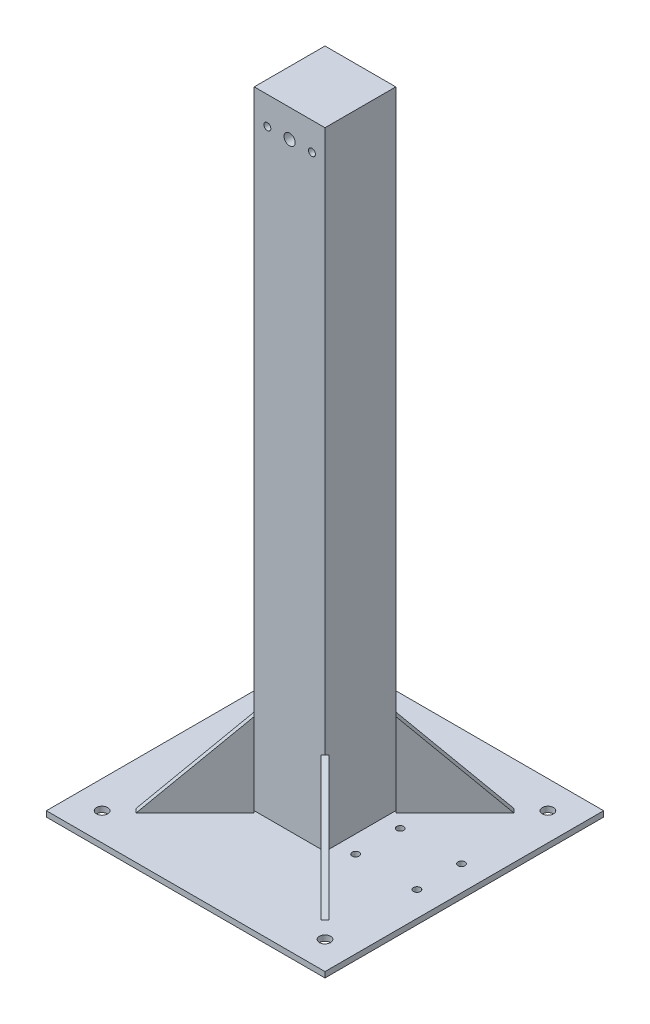
ISO-10303-21;
HEADER;
FILE_DESCRIPTION(('STEP AP214'),'2;1');
FILE_NAME('part.step','',(''),(''),'','','');
FILE_SCHEMA(('AUTOMOTIVE_DESIGN { 1 0 10303 214 1 1 1 1 }'));
ENDSEC;
DATA;
#1=APPLICATION_CONTEXT('core data for automotive mechanical design processes');
#2=APPLICATION_PROTOCOL_DEFINITION('international standard','automotive_design',2000,#1);
#3=PRODUCT_CONTEXT('',#1,'mechanical');
#4=PRODUCT('Part','Part','',(#3));
#5=PRODUCT_RELATED_PRODUCT_CATEGORY('part','',(#4));
#6=PRODUCT_DEFINITION_FORMATION('','',#4);
#7=PRODUCT_DEFINITION_CONTEXT('part definition',#1,'design');
#8=PRODUCT_DEFINITION('design','',#6,#7);
#9=PRODUCT_DEFINITION_SHAPE('','',#8);
#10=(LENGTH_UNIT() NAMED_UNIT(*) SI_UNIT(.MILLI.,.METRE.));
#11=(NAMED_UNIT(*) PLANE_ANGLE_UNIT() SI_UNIT($,.RADIAN.));
#12=(NAMED_UNIT(*) SI_UNIT($,.STERADIAN.) SOLID_ANGLE_UNIT());
#13=UNCERTAINTY_MEASURE_WITH_UNIT(LENGTH_MEASURE(1.E-05),#10,'distance_accuracy_value','');
#14=(GEOMETRIC_REPRESENTATION_CONTEXT(3) GLOBAL_UNCERTAINTY_ASSIGNED_CONTEXT((#13)) GLOBAL_UNIT_ASSIGNED_CONTEXT((#10,
#11,#12)) REPRESENTATION_CONTEXT('',''));
#15=CARTESIAN_POINT('',(0.,0.,0.));
#16=DIRECTION('',(0.,0.,1.));
#17=DIRECTION('',(1.,0.,0.));
#18=AXIS2_PLACEMENT_3D('',#15,#16,#17);
#19=CARTESIAN_POINT('',(26.8142135593491,60.,-23.9857864346029));
#20=DIRECTION('',(-0.707106781186547,0.,0.707106781186547));
#21=DIRECTION('',(0.707106781186548,0.,0.707106781186548));
#22=AXIS2_PLACEMENT_3D('',#19,#20,#21);
#23=PLANE('',#22);
#24=DIRECTION('',(-0.707106781186547,0.,-0.707106781186547));
#25=VECTOR('',#24,1.);
#26=CARTESIAN_POINT('',(26.8142135593491,60.,-23.9857864346029));
#27=LINE('',#26,#25);
#28=CARTESIAN_POINT('',(26.8142135593491,60.,-23.9857864346029));
#29=VERTEX_POINT('',#28);
#30=CARTESIAN_POINT('',(23.9857864346029,60.,-26.8142135593491));
#31=VERTEX_POINT('',#30);
#32=EDGE_CURVE('E47',#29,#31,#27,.T.);
#33=ORIENTED_EDGE('',*,*,#32,.T.);
#34=DIRECTION('',(0.,1.,0.));
#35=VECTOR('',#34,1.);
#36=CARTESIAN_POINT('',(23.9857864346029,60.,-26.8142135593491));
#37=LINE('',#36,#35);
#38=CARTESIAN_POINT('',(23.9857864346029,0.,-26.8142135593491));
#39=VERTEX_POINT('',#38);
#40=EDGE_CURVE('E78',#39,#31,#37,.T.);
#41=ORIENTED_EDGE('',*,*,#40,.F.);
#42=DIRECTION('',(-0.707106781186547,0.,-0.707106781186547));
#43=VECTOR('',#42,1.);
#44=CARTESIAN_POINT('',(26.8142135593491,0.,-23.9857864346029));
#45=LINE('',#44,#43);
#46=CARTESIAN_POINT('',(26.8142135593491,0.,-23.9857864346029));
#47=VERTEX_POINT('',#46);
#48=EDGE_CURVE('E12',#47,#39,#45,.T.);
#49=ORIENTED_EDGE('',*,*,#48,.F.);
#50=DIRECTION('',(0.,1.,0.));
#51=VECTOR('',#50,1.);
#52=CARTESIAN_POINT('',(26.8142135593491,60.,-23.9857864346029));
#53=LINE('',#52,#51);
#54=EDGE_CURVE('E79',#47,#29,#53,.T.);
#55=ORIENTED_EDGE('',*,*,#54,.T.);
#56=EDGE_LOOP('',(#33,#41,#49,#55));
#57=FACE_BOUND('',#56,.T.);
#58=ADVANCED_FACE('F44',(#57),#23,.T.);
#59=CARTESIAN_POINT('',(26.8142135593491,0.,-23.9857864346029));
#60=DIRECTION('',(0.,-1.,0.));
#61=DIRECTION('',(0.,0.,-1.));
#62=AXIS2_PLACEMENT_3D('',#59,#60,#61);
#63=PLANE('',#62);
#64=ORIENTED_EDGE('',*,*,#48,.T.);
#65=DIRECTION('',(-0.707106781186548,0.,0.707106781186548));
#66=VECTOR('',#65,1.);
#67=CARTESIAN_POINT('',(23.9857864346029,0.,-26.8142135593491));
#68=LINE('',#67,#66);
#69=CARTESIAN_POINT('',(66.4121933057957,0.,-69.2406204305419));
#70=VERTEX_POINT('',#69);
#71=EDGE_CURVE('E88',#70,#39,#68,.T.);
#72=ORIENTED_EDGE('',*,*,#71,.F.);
#73=DIRECTION('',(-0.707106781186547,0.,-0.707106781186547));
#74=VECTOR('',#73,1.);
#75=CARTESIAN_POINT('',(69.2406204305419,0.,-66.4121933057957));
#76=LINE('',#75,#74);
#77=CARTESIAN_POINT('',(69.2406204305419,0.,-66.4121933057957));
#78=VERTEX_POINT('',#77);
#79=EDGE_CURVE('E52',#78,#70,#76,.T.);
#80=ORIENTED_EDGE('',*,*,#79,.F.);
#81=DIRECTION('',(-0.707106781186548,0.,0.707106781186548));
#82=VECTOR('',#81,1.);
#83=CARTESIAN_POINT('',(26.8142135593491,0.,-23.9857864346029));
#84=LINE('',#83,#82);
#85=EDGE_CURVE('E82',#78,#47,#84,.T.);
#86=ORIENTED_EDGE('',*,*,#85,.T.);
#87=EDGE_LOOP('',(#64,#72,#80,#86));
#88=FACE_BOUND('',#87,.T.);
#89=ADVANCED_FACE('F98',(#88),#63,.T.);
#90=CARTESIAN_POINT('',(69.2406204305419,0.,-66.4121933057957));
#91=DIRECTION('',(0.5,0.707106781186547,-0.5));
#92=DIRECTION('',(0.,0.577350269189626,0.816496580927726));
#93=AXIS2_PLACEMENT_3D('',#90,#91,#92);
#94=PLANE('',#93);
#95=ORIENTED_EDGE('',*,*,#79,.T.);
#96=DIRECTION('',(0.5,-0.707106781186548,-0.5));
#97=VECTOR('',#96,1.);
#98=CARTESIAN_POINT('',(66.4121933057957,0.,-69.2406204305419));
#99=LINE('',#98,#97);
#100=EDGE_CURVE('E84',#31,#70,#99,.T.);
#101=ORIENTED_EDGE('',*,*,#100,.F.);
#102=ORIENTED_EDGE('',*,*,#32,.F.);
#103=DIRECTION('',(0.5,-0.707106781186548,-0.5));
#104=VECTOR('',#103,1.);
#105=CARTESIAN_POINT('',(69.2406204305419,0.,-66.4121933057957));
#106=LINE('',#105,#104);
#107=EDGE_CURVE('E95',#29,#78,#106,.T.);
#108=ORIENTED_EDGE('',*,*,#107,.T.);
#109=EDGE_LOOP('',(#95,#101,#102,#108));
#110=FACE_BOUND('',#109,.T.);
#111=ADVANCED_FACE('F85',(#110),#94,.T.);
#112=CARTESIAN_POINT('',(1.4142135623731,0.,1.4142135623731));
#113=DIRECTION('',(0.707106781186548,0.,0.707106781186548));
#114=DIRECTION('',(0.707106781186548,0.,-0.707106781186548));
#115=AXIS2_PLACEMENT_3D('',#112,#113,#114);
#116=PLANE('',#115);
#117=ORIENTED_EDGE('',*,*,#54,.F.);
#118=ORIENTED_EDGE('',*,*,#85,.F.);
#119=ORIENTED_EDGE('',*,*,#107,.F.);
#120=EDGE_LOOP('',(#117,#118,#119));
#121=FACE_BOUND('',#120,.T.);
#122=ADVANCED_FACE('F100',(#121),#116,.T.);
#123=CARTESIAN_POINT('',(-1.4142135623731,0.,-1.4142135623731));
#124=DIRECTION('',(0.707106781186548,0.,0.707106781186548));
#125=DIRECTION('',(0.707106781186548,0.,-0.707106781186548));
#126=AXIS2_PLACEMENT_3D('',#123,#124,#125);
#127=PLANE('',#126);
#128=ORIENTED_EDGE('',*,*,#40,.T.);
#129=ORIENTED_EDGE('',*,*,#100,.T.);
#130=ORIENTED_EDGE('',*,*,#71,.T.);
#131=EDGE_LOOP('',(#128,#129,#130));
#132=FACE_BOUND('',#131,.T.);
#133=ADVANCED_FACE('F90',(#132),#127,.F.);
#134=CLOSED_SHELL('',(#58,#89,#111,#122,#133));
#135=MANIFOLD_SOLID_BREP('B2',#134);
#136=CARTESIAN_POINT('',(-23.9857864346029,60.,26.8142135593491));
#137=DIRECTION('',(0.707106781186547,0.,-0.707106781186547));
#138=DIRECTION('',(-0.707106781186548,0.,-0.707106781186548));
#139=AXIS2_PLACEMENT_3D('',#136,#137,#138);
#140=PLANE('',#139);
#141=DIRECTION('',(-0.707106781186547,0.,-0.707106781186547));
#142=VECTOR('',#141,1.);
#143=CARTESIAN_POINT('',(-23.9857864346029,0.,26.8142135593491));
#144=LINE('',#143,#142);
#145=CARTESIAN_POINT('',(-23.9857864346029,0.,26.8142135593491));
#146=VERTEX_POINT('',#145);
#147=CARTESIAN_POINT('',(-26.8142135593491,0.,23.9857864346029));
#148=VERTEX_POINT('',#147);
#149=EDGE_CURVE('E155',#146,#148,#144,.T.);
#150=ORIENTED_EDGE('',*,*,#149,.T.);
#151=DIRECTION('',(0.,-1.,0.));
#152=VECTOR('',#151,1.);
#153=CARTESIAN_POINT('',(-26.8142135593491,60.,23.9857864346029));
#154=LINE('',#153,#152);
#155=CARTESIAN_POINT('',(-26.8142135593491,60.,23.9857864346029));
#156=VERTEX_POINT('',#155);
#157=EDGE_CURVE('E186',#156,#148,#154,.T.);
#158=ORIENTED_EDGE('',*,*,#157,.F.);
#159=DIRECTION('',(-0.707106781186547,0.,-0.707106781186547));
#160=VECTOR('',#159,1.);
#161=CARTESIAN_POINT('',(-23.9857864346029,60.,26.8142135593491));
#162=LINE('',#161,#160);
#163=CARTESIAN_POINT('',(-23.9857864346029,60.,26.8142135593491));
#164=VERTEX_POINT('',#163);
#165=EDGE_CURVE('E42',#164,#156,#162,.T.);
#166=ORIENTED_EDGE('',*,*,#165,.F.);
#167=DIRECTION('',(0.,-1.,0.));
#168=VECTOR('',#167,1.);
#169=CARTESIAN_POINT('',(-23.9857864346029,60.,26.8142135593491));
#170=LINE('',#169,#168);
#171=EDGE_CURVE('E187',#164,#146,#170,.T.);
#172=ORIENTED_EDGE('',*,*,#171,.T.);
#173=EDGE_LOOP('',(#150,#158,#166,#172));
#174=FACE_BOUND('',#173,.T.);
#175=ADVANCED_FACE('F152',(#174),#140,.T.);
#176=CARTESIAN_POINT('',(-66.4121933057957,0.,69.2406204305419));
#177=DIRECTION('',(-0.5,0.707106781186547,0.5));
#178=DIRECTION('',(0.,-0.577350269189626,0.816496580927726));
#179=AXIS2_PLACEMENT_3D('',#176,#177,#178);
#180=PLANE('',#179);
#181=ORIENTED_EDGE('',*,*,#165,.T.);
#182=DIRECTION('',(0.5,0.707106781186548,-0.5));
#183=VECTOR('',#182,1.);
#184=CARTESIAN_POINT('',(-69.2406204305419,0.,66.4121933057957));
#185=LINE('',#184,#183);
#186=CARTESIAN_POINT('',(-69.2406204305419,0.,66.4121933057957));
#187=VERTEX_POINT('',#186);
#188=EDGE_CURVE('E196',#187,#156,#185,.T.);
#189=ORIENTED_EDGE('',*,*,#188,.F.);
#190=DIRECTION('',(-0.707106781186547,0.,-0.707106781186547));
#191=VECTOR('',#190,1.);
#192=CARTESIAN_POINT('',(-66.4121933057957,0.,69.2406204305419));
#193=LINE('',#192,#191);
#194=CARTESIAN_POINT('',(-66.4121933057957,0.,69.2406204305419));
#195=VERTEX_POINT('',#194);
#196=EDGE_CURVE('E160',#195,#187,#193,.T.);
#197=ORIENTED_EDGE('',*,*,#196,.F.);
#198=DIRECTION('',(0.5,0.707106781186548,-0.5));
#199=VECTOR('',#198,1.);
#200=CARTESIAN_POINT('',(-66.4121933057957,0.,69.2406204305419));
#201=LINE('',#200,#199);
#202=EDGE_CURVE('E190',#195,#164,#201,.T.);
#203=ORIENTED_EDGE('',*,*,#202,.T.);
#204=EDGE_LOOP('',(#181,#189,#197,#203));
#205=FACE_BOUND('',#204,.T.);
#206=ADVANCED_FACE('F206',(#205),#180,.T.);
#207=CARTESIAN_POINT('',(-23.9857864346029,0.,26.8142135593491));
#208=DIRECTION('',(0.,-1.,0.));
#209=DIRECTION('',(0.,0.,-1.));
#210=AXIS2_PLACEMENT_3D('',#207,#208,#209);
#211=PLANE('',#210);
#212=ORIENTED_EDGE('',*,*,#196,.T.);
#213=DIRECTION('',(-0.707106781186548,0.,0.707106781186548));
#214=VECTOR('',#213,1.);
#215=CARTESIAN_POINT('',(-26.8142135593491,0.,23.9857864346029));
#216=LINE('',#215,#214);
#217=EDGE_CURVE('E192',#148,#187,#216,.T.);
#218=ORIENTED_EDGE('',*,*,#217,.F.);
#219=ORIENTED_EDGE('',*,*,#149,.F.);
#220=DIRECTION('',(-0.707106781186548,0.,0.707106781186548));
#221=VECTOR('',#220,1.);
#222=CARTESIAN_POINT('',(-23.9857864346029,0.,26.8142135593491));
#223=LINE('',#222,#221);
#224=EDGE_CURVE('E203',#146,#195,#223,.T.);
#225=ORIENTED_EDGE('',*,*,#224,.T.);
#226=EDGE_LOOP('',(#212,#218,#219,#225));
#227=FACE_BOUND('',#226,.T.);
#228=ADVANCED_FACE('F193',(#227),#211,.T.);
#229=CARTESIAN_POINT('',(1.4142135623731,0.,1.4142135623731));
#230=DIRECTION('',(-0.707106781186548,0.,-0.707106781186548));
#231=DIRECTION('',(-0.707106781186548,0.,0.707106781186548));
#232=AXIS2_PLACEMENT_3D('',#229,#230,#231);
#233=PLANE('',#232);
#234=ORIENTED_EDGE('',*,*,#171,.F.);
#235=ORIENTED_EDGE('',*,*,#202,.F.);
#236=ORIENTED_EDGE('',*,*,#224,.F.);
#237=EDGE_LOOP('',(#234,#235,#236));
#238=FACE_BOUND('',#237,.T.);
#239=ADVANCED_FACE('F208',(#238),#233,.F.);
#240=CARTESIAN_POINT('',(-1.4142135623731,0.,-1.4142135623731));
#241=DIRECTION('',(-0.707106781186548,0.,-0.707106781186548));
#242=DIRECTION('',(-0.707106781186548,0.,0.707106781186548));
#243=AXIS2_PLACEMENT_3D('',#240,#241,#242);
#244=PLANE('',#243);
#245=ORIENTED_EDGE('',*,*,#157,.T.);
#246=ORIENTED_EDGE('',*,*,#217,.T.);
#247=ORIENTED_EDGE('',*,*,#188,.T.);
#248=EDGE_LOOP('',(#245,#246,#247));
#249=FACE_BOUND('',#248,.T.);
#250=ADVANCED_FACE('F198',(#249),#244,.T.);
#251=CLOSED_SHELL('',(#175,#206,#228,#239,#250));
#252=MANIFOLD_SOLID_BREP('B6',#251);
#253=CARTESIAN_POINT('',(23.9857864346029,60.,26.8142135593491));
#254=DIRECTION('',(-0.707106781186547,0.,-0.707106781186547));
#255=DIRECTION('',(-0.707106781186548,0.,0.707106781186548));
#256=AXIS2_PLACEMENT_3D('',#253,#254,#255);
#257=PLANE('',#256);
#258=DIRECTION('',(0.707106781186547,0.,-0.707106781186547));
#259=VECTOR('',#258,1.);
#260=CARTESIAN_POINT('',(23.9857864346029,60.,26.8142135593491));
#261=LINE('',#260,#259);
#262=CARTESIAN_POINT('',(23.9857864346029,60.,26.8142135593491));
#263=VERTEX_POINT('',#262);
#264=CARTESIAN_POINT('',(26.8142135593491,60.,23.9857864346029));
#265=VERTEX_POINT('',#264);
#266=EDGE_CURVE('E263',#263,#265,#261,.T.);
#267=ORIENTED_EDGE('',*,*,#266,.T.);
#268=DIRECTION('',(0.,1.,0.));
#269=VECTOR('',#268,1.);
#270=CARTESIAN_POINT('',(26.8142135593491,60.,23.9857864346029));
#271=LINE('',#270,#269);
#272=CARTESIAN_POINT('',(26.8142135593491,0.,23.9857864346029));
#273=VERTEX_POINT('',#272);
#274=EDGE_CURVE('E294',#273,#265,#271,.T.);
#275=ORIENTED_EDGE('',*,*,#274,.F.);
#276=DIRECTION('',(0.707106781186547,0.,-0.707106781186547));
#277=VECTOR('',#276,1.);
#278=CARTESIAN_POINT('',(23.9857864346029,0.,26.8142135593491));
#279=LINE('',#278,#277);
#280=CARTESIAN_POINT('',(23.9857864346029,0.,26.8142135593491));
#281=VERTEX_POINT('',#280);
#282=EDGE_CURVE('E150',#281,#273,#279,.T.);
#283=ORIENTED_EDGE('',*,*,#282,.F.);
#284=DIRECTION('',(0.,1.,0.));
#285=VECTOR('',#284,1.);
#286=CARTESIAN_POINT('',(23.9857864346029,60.,26.8142135593491));
#287=LINE('',#286,#285);
#288=EDGE_CURVE('E295',#281,#263,#287,.T.);
#289=ORIENTED_EDGE('',*,*,#288,.T.);
#290=EDGE_LOOP('',(#267,#275,#283,#289));
#291=FACE_BOUND('',#290,.T.);
#292=ADVANCED_FACE('F260',(#291),#257,.T.);
#293=CARTESIAN_POINT('',(23.9857864346029,0.,26.8142135593491));
#294=DIRECTION('',(0.,-1.,0.));
#295=DIRECTION('',(0.,0.,-1.));
#296=AXIS2_PLACEMENT_3D('',#293,#294,#295);
#297=PLANE('',#296);
#298=ORIENTED_EDGE('',*,*,#282,.T.);
#299=DIRECTION('',(-0.707106781186548,0.,-0.707106781186548));
#300=VECTOR('',#299,1.);
#301=CARTESIAN_POINT('',(26.8142135593491,0.,23.9857864346029));
#302=LINE('',#301,#300);
#303=CARTESIAN_POINT('',(69.2406204305419,0.,66.4121933057957));
#304=VERTEX_POINT('',#303);
#305=EDGE_CURVE('E304',#304,#273,#302,.T.);
#306=ORIENTED_EDGE('',*,*,#305,.F.);
#307=DIRECTION('',(0.707106781186547,0.,-0.707106781186547));
#308=VECTOR('',#307,1.);
#309=CARTESIAN_POINT('',(66.4121933057957,0.,69.2406204305419));
#310=LINE('',#309,#308);
#311=CARTESIAN_POINT('',(66.4121933057957,0.,69.2406204305419));
#312=VERTEX_POINT('',#311);
#313=EDGE_CURVE('E268',#312,#304,#310,.T.);
#314=ORIENTED_EDGE('',*,*,#313,.F.);
#315=DIRECTION('',(-0.707106781186548,0.,-0.707106781186548));
#316=VECTOR('',#315,1.);
#317=CARTESIAN_POINT('',(23.9857864346029,0.,26.8142135593491));
#318=LINE('',#317,#316);
#319=EDGE_CURVE('E298',#312,#281,#318,.T.);
#320=ORIENTED_EDGE('',*,*,#319,.T.);
#321=EDGE_LOOP('',(#298,#306,#314,#320));
#322=FACE_BOUND('',#321,.T.);
#323=ADVANCED_FACE('F314',(#322),#297,.T.);
#324=CARTESIAN_POINT('',(66.4121933057957,0.,69.2406204305419));
#325=DIRECTION('',(0.5,0.707106781186547,0.5));
#326=DIRECTION('',(0.,-0.577350269189626,0.816496580927726));
#327=AXIS2_PLACEMENT_3D('',#324,#325,#326);
#328=PLANE('',#327);
#329=ORIENTED_EDGE('',*,*,#313,.T.);
#330=DIRECTION('',(0.5,-0.707106781186548,0.5));
#331=VECTOR('',#330,1.);
#332=CARTESIAN_POINT('',(69.2406204305419,0.,66.4121933057957));
#333=LINE('',#332,#331);
#334=EDGE_CURVE('E300',#265,#304,#333,.T.);
#335=ORIENTED_EDGE('',*,*,#334,.F.);
#336=ORIENTED_EDGE('',*,*,#266,.F.);
#337=DIRECTION('',(0.5,-0.707106781186548,0.5));
#338=VECTOR('',#337,1.);
#339=CARTESIAN_POINT('',(66.4121933057957,0.,69.2406204305419));
#340=LINE('',#339,#338);
#341=EDGE_CURVE('E311',#263,#312,#340,.T.);
#342=ORIENTED_EDGE('',*,*,#341,.T.);
#343=EDGE_LOOP('',(#329,#335,#336,#342));
#344=FACE_BOUND('',#343,.T.);
#345=ADVANCED_FACE('F301',(#344),#328,.T.);
#346=CARTESIAN_POINT('',(-1.4142135623731,0.,1.4142135623731));
#347=DIRECTION('',(-0.707106781186548,0.,0.707106781186548));
#348=DIRECTION('',(0.707106781186548,0.,0.707106781186548));
#349=AXIS2_PLACEMENT_3D('',#346,#347,#348);
#350=PLANE('',#349);
#351=ORIENTED_EDGE('',*,*,#288,.F.);
#352=ORIENTED_EDGE('',*,*,#319,.F.);
#353=ORIENTED_EDGE('',*,*,#341,.F.);
#354=EDGE_LOOP('',(#351,#352,#353));
#355=FACE_BOUND('',#354,.T.);
#356=ADVANCED_FACE('F316',(#355),#350,.T.);
#357=CARTESIAN_POINT('',(1.4142135623731,0.,-1.4142135623731));
#358=DIRECTION('',(-0.707106781186548,0.,0.707106781186548));
#359=DIRECTION('',(0.707106781186548,0.,0.707106781186548));
#360=AXIS2_PLACEMENT_3D('',#357,#358,#359);
#361=PLANE('',#360);
#362=ORIENTED_EDGE('',*,*,#274,.T.);
#363=ORIENTED_EDGE('',*,*,#334,.T.);
#364=ORIENTED_EDGE('',*,*,#305,.T.);
#365=EDGE_LOOP('',(#362,#363,#364));
#366=FACE_BOUND('',#365,.T.);
#367=ADVANCED_FACE('F306',(#366),#361,.F.);
#368=CLOSED_SHELL('',(#292,#323,#345,#356,#367));
#369=MANIFOLD_SOLID_BREP('B36',#368);
#370=CARTESIAN_POINT('',(-26.8142135593491,60.,-23.9857864346029));
#371=DIRECTION('',(0.707106781186547,0.,0.707106781186547));
#372=DIRECTION('',(0.707106781186548,0.,-0.707106781186548));
#373=AXIS2_PLACEMENT_3D('',#370,#371,#372);
#374=PLANE('',#373);
#375=DIRECTION('',(0.707106781186547,0.,-0.707106781186547));
#376=VECTOR('',#375,1.);
#377=CARTESIAN_POINT('',(-26.8142135593491,0.,-23.9857864346029));
#378=LINE('',#377,#376);
#379=CARTESIAN_POINT('',(-26.8142135593491,0.,-23.9857864346029));
#380=VERTEX_POINT('',#379);
#381=CARTESIAN_POINT('',(-23.9857864346029,0.,-26.8142135593491));
#382=VERTEX_POINT('',#381);
#383=EDGE_CURVE('E370',#380,#382,#378,.T.);
#384=ORIENTED_EDGE('',*,*,#383,.T.);
#385=DIRECTION('',(0.,-1.,0.));
#386=VECTOR('',#385,1.);
#387=CARTESIAN_POINT('',(-23.9857864346029,60.,-26.8142135593491));
#388=LINE('',#387,#386);
#389=CARTESIAN_POINT('',(-23.9857864346029,60.,-26.8142135593491));
#390=VERTEX_POINT('',#389);
#391=EDGE_CURVE('E401',#390,#382,#388,.T.);
#392=ORIENTED_EDGE('',*,*,#391,.F.);
#393=DIRECTION('',(0.707106781186547,0.,-0.707106781186547));
#394=VECTOR('',#393,1.);
#395=CARTESIAN_POINT('',(-26.8142135593491,60.,-23.9857864346029));
#396=LINE('',#395,#394);
#397=CARTESIAN_POINT('',(-26.8142135593491,60.,-23.9857864346029));
#398=VERTEX_POINT('',#397);
#399=EDGE_CURVE('E258',#398,#390,#396,.T.);
#400=ORIENTED_EDGE('',*,*,#399,.F.);
#401=DIRECTION('',(0.,-1.,0.));
#402=VECTOR('',#401,1.);
#403=CARTESIAN_POINT('',(-26.8142135593491,60.,-23.9857864346029));
#404=LINE('',#403,#402);
#405=EDGE_CURVE('E402',#398,#380,#404,.T.);
#406=ORIENTED_EDGE('',*,*,#405,.T.);
#407=EDGE_LOOP('',(#384,#392,#400,#406));
#408=FACE_BOUND('',#407,.T.);
#409=ADVANCED_FACE('F367',(#408),#374,.T.);
#410=CARTESIAN_POINT('',(-69.2406204305419,0.,-66.4121933057957));
#411=DIRECTION('',(-0.5,0.707106781186547,-0.5));
#412=DIRECTION('',(0.,0.577350269189626,0.816496580927726));
#413=AXIS2_PLACEMENT_3D('',#410,#411,#412);
#414=PLANE('',#413);
#415=ORIENTED_EDGE('',*,*,#399,.T.);
#416=DIRECTION('',(0.5,0.707106781186548,0.5));
#417=VECTOR('',#416,1.);
#418=CARTESIAN_POINT('',(-66.4121933057957,0.,-69.2406204305419));
#419=LINE('',#418,#417);
#420=CARTESIAN_POINT('',(-66.4121933057957,0.,-69.2406204305419));
#421=VERTEX_POINT('',#420);
#422=EDGE_CURVE('E411',#421,#390,#419,.T.);
#423=ORIENTED_EDGE('',*,*,#422,.F.);
#424=DIRECTION('',(0.707106781186547,0.,-0.707106781186547));
#425=VECTOR('',#424,1.);
#426=CARTESIAN_POINT('',(-69.2406204305419,0.,-66.4121933057957));
#427=LINE('',#426,#425);
#428=CARTESIAN_POINT('',(-69.2406204305419,0.,-66.4121933057957));
#429=VERTEX_POINT('',#428);
#430=EDGE_CURVE('E375',#429,#421,#427,.T.);
#431=ORIENTED_EDGE('',*,*,#430,.F.);
#432=DIRECTION('',(0.5,0.707106781186548,0.5));
#433=VECTOR('',#432,1.);
#434=CARTESIAN_POINT('',(-69.2406204305419,0.,-66.4121933057957));
#435=LINE('',#434,#433);
#436=EDGE_CURVE('E405',#429,#398,#435,.T.);
#437=ORIENTED_EDGE('',*,*,#436,.T.);
#438=EDGE_LOOP('',(#415,#423,#431,#437));
#439=FACE_BOUND('',#438,.T.);
#440=ADVANCED_FACE('F421',(#439),#414,.T.);
#441=CARTESIAN_POINT('',(-26.8142135593491,0.,-23.9857864346029));
#442=DIRECTION('',(0.,-1.,0.));
#443=DIRECTION('',(0.,0.,-1.));
#444=AXIS2_PLACEMENT_3D('',#441,#442,#443);
#445=PLANE('',#444);
#446=ORIENTED_EDGE('',*,*,#430,.T.);
#447=DIRECTION('',(-0.707106781186547,0.,-0.707106781186547));
#448=VECTOR('',#447,1.);
#449=CARTESIAN_POINT('',(-23.9857864346029,0.,-26.8142135593491));
#450=LINE('',#449,#448);
#451=EDGE_CURVE('E407',#382,#421,#450,.T.);
#452=ORIENTED_EDGE('',*,*,#451,.F.);
#453=ORIENTED_EDGE('',*,*,#383,.F.);
#454=DIRECTION('',(-0.707106781186547,0.,-0.707106781186547));
#455=VECTOR('',#454,1.);
#456=CARTESIAN_POINT('',(-26.8142135593491,0.,-23.9857864346029));
#457=LINE('',#456,#455);
#458=EDGE_CURVE('E418',#380,#429,#457,.T.);
#459=ORIENTED_EDGE('',*,*,#458,.T.);
#460=EDGE_LOOP('',(#446,#452,#453,#459));
#461=FACE_BOUND('',#460,.T.);
#462=ADVANCED_FACE('F408',(#461),#445,.T.);
#463=CARTESIAN_POINT('',(-1.4142135623731,0.,1.4142135623731));
#464=DIRECTION('',(0.707106781186548,0.,-0.707106781186548));
#465=DIRECTION('',(-0.707106781186548,0.,-0.707106781186548));
#466=AXIS2_PLACEMENT_3D('',#463,#464,#465);
#467=PLANE('',#466);
#468=ORIENTED_EDGE('',*,*,#405,.F.);
#469=ORIENTED_EDGE('',*,*,#436,.F.);
#470=ORIENTED_EDGE('',*,*,#458,.F.);
#471=EDGE_LOOP('',(#468,#469,#470));
#472=FACE_BOUND('',#471,.T.);
#473=ADVANCED_FACE('F423',(#472),#467,.F.);
#474=CARTESIAN_POINT('',(1.4142135623731,0.,-1.4142135623731));
#475=DIRECTION('',(0.707106781186548,0.,-0.707106781186548));
#476=DIRECTION('',(-0.707106781186548,0.,-0.707106781186548));
#477=AXIS2_PLACEMENT_3D('',#474,#475,#476);
#478=PLANE('',#477);
#479=ORIENTED_EDGE('',*,*,#391,.T.);
#480=ORIENTED_EDGE('',*,*,#451,.T.);
#481=ORIENTED_EDGE('',*,*,#422,.T.);
#482=EDGE_LOOP('',(#479,#480,#481));
#483=FACE_BOUND('',#482,.T.);
#484=ADVANCED_FACE('F413',(#483),#478,.T.);
#485=CLOSED_SHELL('',(#409,#440,#462,#473,#484));
#486=MANIFOLD_SOLID_BREP('B144',#485);
#487=CARTESIAN_POINT('',(100.,-4.,-100.));
#488=DIRECTION('',(1.,0.,0.));
#489=DIRECTION('',(0.,0.,-1.));
#490=AXIS2_PLACEMENT_3D('',#487,#488,#489);
#491=PLANE('',#490);
#492=DIRECTION('',(0.,0.,-1.));
#493=VECTOR('',#492,1.);
#494=CARTESIAN_POINT('',(100.,0.,-100.));
#495=LINE('',#494,#493);
#496=CARTESIAN_POINT('',(100.,0.,100.));
#497=VERTEX_POINT('',#496);
#498=CARTESIAN_POINT('',(100.,0.,-100.));
#499=VERTEX_POINT('',#498);
#500=EDGE_CURVE('E550',#497,#499,#495,.T.);
#501=ORIENTED_EDGE('',*,*,#500,.F.);
#502=DIRECTION('',(0.,1.,0.));
#503=VECTOR('',#502,1.);
#504=CARTESIAN_POINT('',(100.,-4.,100.));
#505=LINE('',#504,#503);
#506=CARTESIAN_POINT('',(100.,-4.,100.));
#507=VERTEX_POINT('',#506);
#508=EDGE_CURVE('E365',#507,#497,#505,.T.);
#509=ORIENTED_EDGE('',*,*,#508,.F.);
#510=DIRECTION('',(0.,0.,-1.));
#511=VECTOR('',#510,1.);
#512=CARTESIAN_POINT('',(100.,-4.,-100.));
#513=LINE('',#512,#511);
#514=CARTESIAN_POINT('',(100.,-4.,-100.));
#515=VERTEX_POINT('',#514);
#516=EDGE_CURVE('E559',#507,#515,#513,.T.);
#517=ORIENTED_EDGE('',*,*,#516,.T.);
#518=DIRECTION('',(0.,1.,0.));
#519=VECTOR('',#518,1.);
#520=CARTESIAN_POINT('',(100.,-4.,-100.));
#521=LINE('',#520,#519);
#522=EDGE_CURVE('E468',#515,#499,#521,.T.);
#523=ORIENTED_EDGE('',*,*,#522,.T.);
#524=EDGE_LOOP('',(#501,#509,#517,#523));
#525=FACE_BOUND('',#524,.T.);
#526=ADVANCED_FACE('F465',(#525),#491,.T.);
#527=CARTESIAN_POINT('',(-100.,-4.,100.));
#528=DIRECTION('',(0.,0.,1.));
#529=DIRECTION('',(1.,0.,0.));
#530=AXIS2_PLACEMENT_3D('',#527,#528,#529);
#531=PLANE('',#530);
#532=DIRECTION('',(1.,0.,0.));
#533=VECTOR('',#532,1.);
#534=CARTESIAN_POINT('',(-100.,0.,100.));
#535=LINE('',#534,#533);
#536=CARTESIAN_POINT('',(-100.,0.,100.));
#537=VERTEX_POINT('',#536);
#538=EDGE_CURVE('E563',#537,#497,#535,.T.);
#539=ORIENTED_EDGE('',*,*,#538,.F.);
#540=DIRECTION('',(0.,1.,0.));
#541=VECTOR('',#540,1.);
#542=CARTESIAN_POINT('',(-100.,-4.,100.));
#543=LINE('',#542,#541);
#544=CARTESIAN_POINT('',(-100.,-4.,100.));
#545=VERTEX_POINT('',#544);
#546=EDGE_CURVE('E473',#545,#537,#543,.T.);
#547=ORIENTED_EDGE('',*,*,#546,.F.);
#548=DIRECTION('',(1.,0.,0.));
#549=VECTOR('',#548,1.);
#550=CARTESIAN_POINT('',(-100.,-4.,100.));
#551=LINE('',#550,#549);
#552=EDGE_CURVE('E569',#545,#507,#551,.T.);
#553=ORIENTED_EDGE('',*,*,#552,.T.);
#554=ORIENTED_EDGE('',*,*,#508,.T.);
#555=EDGE_LOOP('',(#539,#547,#553,#554));
#556=FACE_BOUND('',#555,.T.);
#557=ADVANCED_FACE('F592',(#556),#531,.T.);
#558=CARTESIAN_POINT('',(-100.,-4.,-100.));
#559=DIRECTION('',(-1.,0.,0.));
#560=DIRECTION('',(0.,0.,1.));
#561=AXIS2_PLACEMENT_3D('',#558,#559,#560);
#562=PLANE('',#561);
#563=DIRECTION('',(0.,0.,1.));
#564=VECTOR('',#563,1.);
#565=CARTESIAN_POINT('',(-100.,0.,-100.));
#566=LINE('',#565,#564);
#567=CARTESIAN_POINT('',(-100.,0.,-100.));
#568=VERTEX_POINT('',#567);
#569=EDGE_CURVE('E574',#568,#537,#566,.T.);
#570=ORIENTED_EDGE('',*,*,#569,.F.);
#571=DIRECTION('',(0.,1.,0.));
#572=VECTOR('',#571,1.);
#573=CARTESIAN_POINT('',(-100.,-4.,-100.));
#574=LINE('',#573,#572);
#575=CARTESIAN_POINT('',(-100.,-4.,-100.));
#576=VERTEX_POINT('',#575);
#577=EDGE_CURVE('E579',#576,#568,#574,.T.);
#578=ORIENTED_EDGE('',*,*,#577,.F.);
#579=DIRECTION('',(0.,0.,1.));
#580=VECTOR('',#579,1.);
#581=CARTESIAN_POINT('',(-100.,-4.,-100.));
#582=LINE('',#581,#580);
#583=EDGE_CURVE('E566',#576,#545,#582,.T.);
#584=ORIENTED_EDGE('',*,*,#583,.T.);
#585=ORIENTED_EDGE('',*,*,#546,.T.);
#586=EDGE_LOOP('',(#570,#578,#584,#585));
#587=FACE_BOUND('',#586,.T.);
#588=ADVANCED_FACE('F598',(#587),#562,.T.);
#589=CARTESIAN_POINT('',(-100.,-4.,-100.));
#590=DIRECTION('',(0.,0.,-1.));
#591=DIRECTION('',(-1.,0.,0.));
#592=AXIS2_PLACEMENT_3D('',#589,#590,#591);
#593=PLANE('',#592);
#594=DIRECTION('',(-1.,0.,0.));
#595=VECTOR('',#594,1.);
#596=CARTESIAN_POINT('',(-100.,0.,-100.));
#597=LINE('',#596,#595);
#598=EDGE_CURVE('E553',#499,#568,#597,.T.);
#599=ORIENTED_EDGE('',*,*,#598,.F.);
#600=ORIENTED_EDGE('',*,*,#522,.F.);
#601=DIRECTION('',(-1.,0.,0.));
#602=VECTOR('',#601,1.);
#603=CARTESIAN_POINT('',(-100.,-4.,-100.));
#604=LINE('',#603,#602);
#605=EDGE_CURVE('E562',#515,#576,#604,.T.);
#606=ORIENTED_EDGE('',*,*,#605,.T.);
#607=ORIENTED_EDGE('',*,*,#577,.T.);
#608=EDGE_LOOP('',(#599,#600,#606,#607));
#609=FACE_BOUND('',#608,.T.);
#610=ADVANCED_FACE('F587',(#609),#593,.T.);
#611=CARTESIAN_POINT('',(0.,-4.,0.));
#612=DIRECTION('',(0.,1.,0.));
#613=DIRECTION('',(0.,0.,1.));
#614=AXIS2_PLACEMENT_3D('',#611,#612,#613);
#615=PLANE('',#614);
#616=CARTESIAN_POINT('',(38.,-4.,-16.));
#617=DIRECTION('',(0.,1.,0.));
#618=DIRECTION('',(0.,0.,1.));
#619=AXIS2_PLACEMENT_3D('',#616,#617,#618);
#620=CIRCLE('',#619,2.5);
#621=CARTESIAN_POINT('',(38.,-4.,-13.5));
#622=VERTEX_POINT('',#621);
#623=EDGE_CURVE('E803',#622,#622,#620,.T.);
#624=ORIENTED_EDGE('',*,*,#623,.T.);
#625=EDGE_LOOP('',(#624));
#626=FACE_BOUND('',#625,.T.);
#627=CARTESIAN_POINT('',(38.,-4.,16.));
#628=DIRECTION('',(0.,1.,0.));
#629=DIRECTION('',(0.,0.,1.));
#630=AXIS2_PLACEMENT_3D('',#627,#628,#629);
#631=CIRCLE('',#630,2.5);
#632=CARTESIAN_POINT('',(38.,-4.,18.5));
#633=VERTEX_POINT('',#632);
#634=EDGE_CURVE('E914',#633,#633,#631,.T.);
#635=ORIENTED_EDGE('',*,*,#634,.T.);
#636=EDGE_LOOP('',(#635));
#637=FACE_BOUND('',#636,.T.);
#638=CARTESIAN_POINT('',(82.,-4.,16.));
#639=DIRECTION('',(0.,1.,0.));
#640=DIRECTION('',(0.,0.,1.));
#641=AXIS2_PLACEMENT_3D('',#638,#639,#640);
#642=CIRCLE('',#641,2.49999999999999);
#643=CARTESIAN_POINT('',(82.,-4.,18.5));
#644=VERTEX_POINT('',#643);
#645=EDGE_CURVE('E819',#644,#644,#642,.T.);
#646=ORIENTED_EDGE('',*,*,#645,.T.);
#647=EDGE_LOOP('',(#646));
#648=FACE_BOUND('',#647,.T.);
#649=CARTESIAN_POINT('',(82.,-4.,-16.));
#650=DIRECTION('',(0.,1.,0.));
#651=DIRECTION('',(0.,0.,1.));
#652=AXIS2_PLACEMENT_3D('',#649,#650,#651);
#653=CIRCLE('',#652,2.50000000000001);
#654=CARTESIAN_POINT('',(82.,-4.,-13.5));
#655=VERTEX_POINT('',#654);
#656=EDGE_CURVE('E812',#655,#655,#653,.T.);
#657=ORIENTED_EDGE('',*,*,#656,.T.);
#658=EDGE_LOOP('',(#657));
#659=FACE_BOUND('',#658,.T.);
#660=CARTESIAN_POINT('',(-80.,-4.,80.));
#661=DIRECTION('',(0.,1.,0.));
#662=DIRECTION('',(0.,0.,1.));
#663=AXIS2_PLACEMENT_3D('',#660,#661,#662);
#664=CIRCLE('',#663,4.00000000000001);
#665=CARTESIAN_POINT('',(-80.,-4.,84.));
#666=VERTEX_POINT('',#665);
#667=EDGE_CURVE('E851',#666,#666,#664,.T.);
#668=ORIENTED_EDGE('',*,*,#667,.T.);
#669=EDGE_LOOP('',(#668));
#670=FACE_BOUND('',#669,.T.);
#671=CARTESIAN_POINT('',(-80.,-4.,-80.));
#672=DIRECTION('',(0.,1.,0.));
#673=DIRECTION('',(0.,0.,1.));
#674=AXIS2_PLACEMENT_3D('',#671,#672,#673);
#675=CIRCLE('',#674,4.00000000000001);
#676=CARTESIAN_POINT('',(-80.,-4.,-76.));
#677=VERTEX_POINT('',#676);
#678=EDGE_CURVE('E845',#677,#677,#675,.T.);
#679=ORIENTED_EDGE('',*,*,#678,.T.);
#680=EDGE_LOOP('',(#679));
#681=FACE_BOUND('',#680,.T.);
#682=CARTESIAN_POINT('',(80.,-4.,-80.));
#683=DIRECTION('',(0.,1.,0.));
#684=DIRECTION('',(0.,0.,1.));
#685=AXIS2_PLACEMENT_3D('',#682,#683,#684);
#686=CIRCLE('',#685,4.00000000000001);
#687=CARTESIAN_POINT('',(80.,-4.,-76.));
#688=VERTEX_POINT('',#687);
#689=EDGE_CURVE('E838',#688,#688,#686,.T.);
#690=ORIENTED_EDGE('',*,*,#689,.T.);
#691=EDGE_LOOP('',(#690));
#692=FACE_BOUND('',#691,.T.);
#693=CARTESIAN_POINT('',(80.,-4.,80.));
#694=DIRECTION('',(0.,1.,0.));
#695=DIRECTION('',(0.,0.,1.));
#696=AXIS2_PLACEMENT_3D('',#693,#694,#695);
#697=CIRCLE('',#696,4.00000000000001);
#698=CARTESIAN_POINT('',(80.,-4.,84.));
#699=VERTEX_POINT('',#698);
#700=EDGE_CURVE('E856',#699,#699,#697,.T.);
#701=ORIENTED_EDGE('',*,*,#700,.T.);
#702=EDGE_LOOP('',(#701));
#703=FACE_BOUND('',#702,.T.);
#704=ORIENTED_EDGE('',*,*,#516,.F.);
#705=ORIENTED_EDGE('',*,*,#552,.F.);
#706=ORIENTED_EDGE('',*,*,#583,.F.);
#707=ORIENTED_EDGE('',*,*,#605,.F.);
#708=EDGE_LOOP('',(#704,#705,#706,#707));
#709=FACE_BOUND('',#708,.T.);
#710=ADVANCED_FACE('F595',(#626,#637,#648,#659,#670,#681,#692,#703,#709),#615,.F.);
#711=CARTESIAN_POINT('',(0.,0.,0.));
#712=DIRECTION('',(0.,1.,0.));
#713=DIRECTION('',(0.,0.,1.));
#714=AXIS2_PLACEMENT_3D('',#711,#712,#713);
#715=PLANE('',#714);
#716=CARTESIAN_POINT('',(38.,0.,-16.));
#717=DIRECTION('',(0.,1.,0.));
#718=DIRECTION('',(0.,0.,1.));
#719=AXIS2_PLACEMENT_3D('',#716,#717,#718);
#720=CIRCLE('',#719,2.5);
#721=CARTESIAN_POINT('',(38.,0.,-13.5));
#722=VERTEX_POINT('',#721);
#723=EDGE_CURVE('E806',#722,#722,#720,.T.);
#724=ORIENTED_EDGE('',*,*,#723,.F.);
#725=EDGE_LOOP('',(#724));
#726=FACE_BOUND('',#725,.T.);
#727=CARTESIAN_POINT('',(38.,0.,16.));
#728=DIRECTION('',(0.,1.,0.));
#729=DIRECTION('',(0.,0.,1.));
#730=AXIS2_PLACEMENT_3D('',#727,#728,#729);
#731=CIRCLE('',#730,2.5);
#732=CARTESIAN_POINT('',(38.,0.,18.5));
#733=VERTEX_POINT('',#732);
#734=EDGE_CURVE('E808',#733,#733,#731,.T.);
#735=ORIENTED_EDGE('',*,*,#734,.F.);
#736=EDGE_LOOP('',(#735));
#737=FACE_BOUND('',#736,.T.);
#738=CARTESIAN_POINT('',(82.,0.,16.));
#739=DIRECTION('',(0.,1.,0.));
#740=DIRECTION('',(0.,0.,1.));
#741=AXIS2_PLACEMENT_3D('',#738,#739,#740);
#742=CIRCLE('',#741,2.49999999999999);
#743=CARTESIAN_POINT('',(82.,0.,18.5));
#744=VERTEX_POINT('',#743);
#745=EDGE_CURVE('E909',#744,#744,#742,.T.);
#746=ORIENTED_EDGE('',*,*,#745,.F.);
#747=EDGE_LOOP('',(#746));
#748=FACE_BOUND('',#747,.T.);
#749=CARTESIAN_POINT('',(82.,0.,-16.));
#750=DIRECTION('',(0.,1.,0.));
#751=DIRECTION('',(0.,0.,1.));
#752=AXIS2_PLACEMENT_3D('',#749,#750,#751);
#753=CIRCLE('',#752,2.50000000000001);
#754=CARTESIAN_POINT('',(82.,0.,-13.5));
#755=VERTEX_POINT('',#754);
#756=EDGE_CURVE('E816',#755,#755,#753,.T.);
#757=ORIENTED_EDGE('',*,*,#756,.F.);
#758=EDGE_LOOP('',(#757));
#759=FACE_BOUND('',#758,.T.);
#760=CARTESIAN_POINT('',(-80.,0.,80.));
#761=DIRECTION('',(0.,1.,0.));
#762=DIRECTION('',(0.,0.,1.));
#763=AXIS2_PLACEMENT_3D('',#760,#761,#762);
#764=CIRCLE('',#763,4.00000000000001);
#765=CARTESIAN_POINT('',(-80.,0.,84.));
#766=VERTEX_POINT('',#765);
#767=EDGE_CURVE('E837',#766,#766,#764,.T.);
#768=ORIENTED_EDGE('',*,*,#767,.F.);
#769=EDGE_LOOP('',(#768));
#770=FACE_BOUND('',#769,.T.);
#771=CARTESIAN_POINT('',(-80.,0.,-80.));
#772=DIRECTION('',(0.,1.,0.));
#773=DIRECTION('',(0.,0.,1.));
#774=AXIS2_PLACEMENT_3D('',#771,#772,#773);
#775=CIRCLE('',#774,4.00000000000001);
#776=CARTESIAN_POINT('',(-80.,0.,-76.));
#777=VERTEX_POINT('',#776);
#778=EDGE_CURVE('E848',#777,#777,#775,.T.);
#779=ORIENTED_EDGE('',*,*,#778,.F.);
#780=EDGE_LOOP('',(#779));
#781=FACE_BOUND('',#780,.T.);
#782=CARTESIAN_POINT('',(80.,0.,-80.));
#783=DIRECTION('',(0.,1.,0.));
#784=DIRECTION('',(0.,0.,1.));
#785=AXIS2_PLACEMENT_3D('',#782,#783,#784);
#786=CIRCLE('',#785,4.00000000000001);
#787=CARTESIAN_POINT('',(80.,0.,-76.));
#788=VERTEX_POINT('',#787);
#789=EDGE_CURVE('E842',#788,#788,#786,.T.);
#790=ORIENTED_EDGE('',*,*,#789,.F.);
#791=EDGE_LOOP('',(#790));
#792=FACE_BOUND('',#791,.T.);
#793=CARTESIAN_POINT('',(80.,0.,80.));
#794=DIRECTION('',(0.,1.,0.));
#795=DIRECTION('',(0.,0.,1.));
#796=AXIS2_PLACEMENT_3D('',#793,#794,#795);
#797=CIRCLE('',#796,4.00000000000001);
#798=CARTESIAN_POINT('',(80.,0.,84.));
#799=VERTEX_POINT('',#798);
#800=EDGE_CURVE('E841',#799,#799,#797,.T.);
#801=ORIENTED_EDGE('',*,*,#800,.F.);
#802=EDGE_LOOP('',(#801));
#803=FACE_BOUND('',#802,.T.);
#804=DIRECTION('',(0.,0.,-1.));
#805=VECTOR('',#804,1.);
#806=CARTESIAN_POINT('',(25.4,0.,-25.4));
#807=LINE('',#806,#805);
#808=CARTESIAN_POINT('',(25.4,0.,25.4));
#809=VERTEX_POINT('',#808);
#810=CARTESIAN_POINT('',(25.4,0.,-25.4));
#811=VERTEX_POINT('',#810);
#812=EDGE_CURVE('E481',#809,#811,#807,.T.);
#813=ORIENTED_EDGE('',*,*,#812,.F.);
#814=DIRECTION('',(1.,0.,0.));
#815=VECTOR('',#814,1.);
#816=CARTESIAN_POINT('',(-25.4,0.,25.4));
#817=LINE('',#816,#815);
#818=CARTESIAN_POINT('',(-25.4,0.,25.4));
#819=VERTEX_POINT('',#818);
#820=EDGE_CURVE('E485',#819,#809,#817,.T.);
#821=ORIENTED_EDGE('',*,*,#820,.F.);
#822=DIRECTION('',(0.,0.,1.));
#823=VECTOR('',#822,1.);
#824=CARTESIAN_POINT('',(-25.4,0.,-25.4));
#825=LINE('',#824,#823);
#826=CARTESIAN_POINT('',(-25.4,0.,-25.4));
#827=VERTEX_POINT('',#826);
#828=EDGE_CURVE('E867',#827,#819,#825,.T.);
#829=ORIENTED_EDGE('',*,*,#828,.F.);
#830=DIRECTION('',(-1.,0.,0.));
#831=VECTOR('',#830,1.);
#832=CARTESIAN_POINT('',(-25.4,0.,-25.4));
#833=LINE('',#832,#831);
#834=EDGE_CURVE('E865',#811,#827,#833,.T.);
#835=ORIENTED_EDGE('',*,*,#834,.F.);
#836=EDGE_LOOP('',(#813,#821,#829,#835));
#837=FACE_BOUND('',#836,.T.);
#838=ORIENTED_EDGE('',*,*,#500,.T.);
#839=ORIENTED_EDGE('',*,*,#598,.T.);
#840=ORIENTED_EDGE('',*,*,#569,.T.);
#841=ORIENTED_EDGE('',*,*,#538,.T.);
#842=EDGE_LOOP('',(#838,#839,#840,#841));
#843=FACE_BOUND('',#842,.T.);
#844=ADVANCED_FACE('F589',(#726,#737,#748,#759,#770,#781,#792,#803,#837,#843),#715,.T.);
#845=CARTESIAN_POINT('',(25.4,450.,-25.4));
#846=DIRECTION('',(-1.,0.,0.));
#847=DIRECTION('',(0.,0.,1.));
#848=AXIS2_PLACEMENT_3D('',#845,#846,#847);
#849=PLANE('',#848);
#850=ORIENTED_EDGE('',*,*,#812,.T.);
#851=DIRECTION('',(0.,-1.,0.));
#852=VECTOR('',#851,1.);
#853=CARTESIAN_POINT('',(25.4,450.,-25.4));
#854=LINE('',#853,#852);
#855=CARTESIAN_POINT('',(25.4,450.,-25.4));
#856=VERTEX_POINT('',#855);
#857=EDGE_CURVE('E533',#856,#811,#854,.T.);
#858=ORIENTED_EDGE('',*,*,#857,.F.);
#859=DIRECTION('',(0.,0.,-1.));
#860=VECTOR('',#859,1.);
#861=CARTESIAN_POINT('',(25.4,450.,-25.4));
#862=LINE('',#861,#860);
#863=CARTESIAN_POINT('',(25.4,450.,25.4));
#864=VERTEX_POINT('',#863);
#865=EDGE_CURVE('E539',#864,#856,#862,.T.);
#866=ORIENTED_EDGE('',*,*,#865,.F.);
#867=DIRECTION('',(0.,-1.,0.));
#868=VECTOR('',#867,1.);
#869=CARTESIAN_POINT('',(25.4,450.,25.4));
#870=LINE('',#869,#868);
#871=EDGE_CURVE('E863',#864,#809,#870,.T.);
#872=ORIENTED_EDGE('',*,*,#871,.T.);
#873=EDGE_LOOP('',(#850,#858,#866,#872));
#874=FACE_BOUND('',#873,.T.);
#875=ADVANCED_FACE('F549',(#874),#849,.F.);
#876=CARTESIAN_POINT('',(-25.4,450.,-25.4));
#877=DIRECTION('',(0.,0.,1.));
#878=DIRECTION('',(1.,0.,0.));
#879=AXIS2_PLACEMENT_3D('',#876,#877,#878);
#880=PLANE('',#879);
#881=CARTESIAN_POINT('',(-16.,430.,-25.4));
#882=DIRECTION('',(0.,0.,1.));
#883=DIRECTION('',(1.,0.,0.));
#884=AXIS2_PLACEMENT_3D('',#881,#882,#883);
#885=CIRCLE('',#884,2.5);
#886=CARTESIAN_POINT('',(-13.5,430.,-25.4));
#887=VERTEX_POINT('',#886);
#888=EDGE_CURVE('E815',#887,#887,#885,.T.);
#889=ORIENTED_EDGE('',*,*,#888,.T.);
#890=EDGE_LOOP('',(#889));
#891=FACE_BOUND('',#890,.T.);
#892=CARTESIAN_POINT('',(16.,430.,-25.4));
#893=DIRECTION('',(0.,0.,1.));
#894=DIRECTION('',(1.,0.,0.));
#895=AXIS2_PLACEMENT_3D('',#892,#893,#894);
#896=CIRCLE('',#895,2.5);
#897=CARTESIAN_POINT('',(18.5,430.,-25.4));
#898=VERTEX_POINT('',#897);
#899=EDGE_CURVE('E820',#898,#898,#896,.T.);
#900=ORIENTED_EDGE('',*,*,#899,.T.);
#901=EDGE_LOOP('',(#900));
#902=FACE_BOUND('',#901,.T.);
#903=CARTESIAN_POINT('',(0.,430.,-25.4));
#904=DIRECTION('',(0.,0.,1.));
#905=DIRECTION('',(1.,0.,0.));
#906=AXIS2_PLACEMENT_3D('',#903,#904,#905);
#907=CIRCLE('',#906,4.);
#908=CARTESIAN_POINT('',(4.,430.,-25.4));
#909=VERTEX_POINT('',#908);
#910=EDGE_CURVE('E827',#909,#909,#907,.T.);
#911=ORIENTED_EDGE('',*,*,#910,.T.);
#912=EDGE_LOOP('',(#911));
#913=FACE_BOUND('',#912,.T.);
#914=ORIENTED_EDGE('',*,*,#834,.T.);
#915=DIRECTION('',(0.,-1.,0.));
#916=VECTOR('',#915,1.);
#917=CARTESIAN_POINT('',(-25.4,450.,-25.4));
#918=LINE('',#917,#916);
#919=CARTESIAN_POINT('',(-25.4,450.,-25.4));
#920=VERTEX_POINT('',#919);
#921=EDGE_CURVE('E535',#920,#827,#918,.T.);
#922=ORIENTED_EDGE('',*,*,#921,.F.);
#923=DIRECTION('',(-1.,0.,0.));
#924=VECTOR('',#923,1.);
#925=CARTESIAN_POINT('',(-25.4,450.,-25.4));
#926=LINE('',#925,#924);
#927=EDGE_CURVE('E528',#856,#920,#926,.T.);
#928=ORIENTED_EDGE('',*,*,#927,.F.);
#929=ORIENTED_EDGE('',*,*,#857,.T.);
#930=EDGE_LOOP('',(#914,#922,#928,#929));
#931=FACE_BOUND('',#930,.T.);
#932=ADVANCED_FACE('F531',(#891,#902,#913,#931),#880,.F.);
#933=CARTESIAN_POINT('',(-25.4,450.,-25.4));
#934=DIRECTION('',(1.,0.,0.));
#935=DIRECTION('',(0.,0.,-1.));
#936=AXIS2_PLACEMENT_3D('',#933,#934,#935);
#937=PLANE('',#936);
#938=ORIENTED_EDGE('',*,*,#828,.T.);
#939=DIRECTION('',(0.,-1.,0.));
#940=VECTOR('',#939,1.);
#941=CARTESIAN_POINT('',(-25.4,450.,25.4));
#942=LINE('',#941,#940);
#943=CARTESIAN_POINT('',(-25.4,450.,25.4));
#944=VERTEX_POINT('',#943);
#945=EDGE_CURVE('E555',#944,#819,#942,.T.);
#946=ORIENTED_EDGE('',*,*,#945,.F.);
#947=DIRECTION('',(0.,0.,1.));
#948=VECTOR('',#947,1.);
#949=CARTESIAN_POINT('',(-25.4,450.,-25.4));
#950=LINE('',#949,#948);
#951=EDGE_CURVE('E538',#920,#944,#950,.T.);
#952=ORIENTED_EDGE('',*,*,#951,.F.);
#953=ORIENTED_EDGE('',*,*,#921,.T.);
#954=EDGE_LOOP('',(#938,#946,#952,#953));
#955=FACE_BOUND('',#954,.T.);
#956=ADVANCED_FACE('F642',(#955),#937,.F.);
#957=CARTESIAN_POINT('',(-25.4,450.,25.4));
#958=DIRECTION('',(0.,0.,-1.));
#959=DIRECTION('',(-1.,0.,0.));
#960=AXIS2_PLACEMENT_3D('',#957,#958,#959);
#961=PLANE('',#960);
#962=CARTESIAN_POINT('',(-16.,430.,25.4));
#963=DIRECTION('',(0.,0.,1.));
#964=DIRECTION('',(1.,0.,0.));
#965=AXIS2_PLACEMENT_3D('',#962,#963,#964);
#966=CIRCLE('',#965,2.5);
#967=CARTESIAN_POINT('',(-13.5,430.,25.4));
#968=VERTEX_POINT('',#967);
#969=EDGE_CURVE('E824',#968,#968,#966,.T.);
#970=ORIENTED_EDGE('',*,*,#969,.F.);
#971=EDGE_LOOP('',(#970));
#972=FACE_BOUND('',#971,.T.);
#973=CARTESIAN_POINT('',(16.,430.,25.4));
#974=DIRECTION('',(0.,0.,1.));
#975=DIRECTION('',(1.,0.,0.));
#976=AXIS2_PLACEMENT_3D('',#973,#974,#975);
#977=CIRCLE('',#976,2.5);
#978=CARTESIAN_POINT('',(18.5,430.,25.4));
#979=VERTEX_POINT('',#978);
#980=EDGE_CURVE('E823',#979,#979,#977,.T.);
#981=ORIENTED_EDGE('',*,*,#980,.F.);
#982=EDGE_LOOP('',(#981));
#983=FACE_BOUND('',#982,.T.);
#984=CARTESIAN_POINT('',(0.,430.,25.4));
#985=DIRECTION('',(0.,0.,1.));
#986=DIRECTION('',(1.,0.,0.));
#987=AXIS2_PLACEMENT_3D('',#984,#985,#986);
#988=CIRCLE('',#987,4.);
#989=CARTESIAN_POINT('',(4.,430.,25.4));
#990=VERTEX_POINT('',#989);
#991=EDGE_CURVE('E834',#990,#990,#988,.T.);
#992=ORIENTED_EDGE('',*,*,#991,.F.);
#993=EDGE_LOOP('',(#992));
#994=FACE_BOUND('',#993,.T.);
#995=ORIENTED_EDGE('',*,*,#820,.T.);
#996=ORIENTED_EDGE('',*,*,#871,.F.);
#997=DIRECTION('',(1.,0.,0.));
#998=VECTOR('',#997,1.);
#999=CARTESIAN_POINT('',(-25.4,450.,25.4));
#1000=LINE('',#999,#998);
#1001=EDGE_CURVE('E544',#944,#864,#1000,.T.);
#1002=ORIENTED_EDGE('',*,*,#1001,.F.);
#1003=ORIENTED_EDGE('',*,*,#945,.T.);
#1004=EDGE_LOOP('',(#995,#996,#1002,#1003));
#1005=FACE_BOUND('',#1004,.T.);
#1006=ADVANCED_FACE('F647',(#972,#983,#994,#1005),#961,.F.);
#1007=CARTESIAN_POINT('',(0.,450.,0.));
#1008=DIRECTION('',(0.,1.,0.));
#1009=DIRECTION('',(0.,0.,1.));
#1010=AXIS2_PLACEMENT_3D('',#1007,#1008,#1009);
#1011=PLANE('',#1010);
#1012=ORIENTED_EDGE('',*,*,#865,.T.);
#1013=ORIENTED_EDGE('',*,*,#927,.T.);
#1014=ORIENTED_EDGE('',*,*,#951,.T.);
#1015=ORIENTED_EDGE('',*,*,#1001,.T.);
#1016=EDGE_LOOP('',(#1012,#1013,#1014,#1015));
#1017=FACE_BOUND('',#1016,.T.);
#1018=ADVANCED_FACE('F542',(#1017),#1011,.T.);
#1019=CARTESIAN_POINT('',(80.,-4.,80.));
#1020=DIRECTION('',(0.,1.,0.));
#1021=DIRECTION('',(0.,0.,1.));
#1022=AXIS2_PLACEMENT_3D('',#1019,#1020,#1021);
#1023=CYLINDRICAL_SURFACE('',#1022,4.00000000000001);
#1024=ORIENTED_EDGE('',*,*,#700,.F.);
#1025=EDGE_LOOP('',(#1024));
#1026=FACE_BOUND('',#1025,.T.);
#1027=ORIENTED_EDGE('',*,*,#800,.T.);
#1028=EDGE_LOOP('',(#1027));
#1029=FACE_BOUND('',#1028,.T.);
#1030=ADVANCED_FACE('F659',(#1026,#1029),#1023,.F.);
#1031=CARTESIAN_POINT('',(80.,-4.,-80.));
#1032=DIRECTION('',(0.,1.,0.));
#1033=DIRECTION('',(0.,0.,1.));
#1034=AXIS2_PLACEMENT_3D('',#1031,#1032,#1033);
#1035=CYLINDRICAL_SURFACE('',#1034,4.00000000000001);
#1036=ORIENTED_EDGE('',*,*,#689,.F.);
#1037=EDGE_LOOP('',(#1036));
#1038=FACE_BOUND('',#1037,.T.);
#1039=ORIENTED_EDGE('',*,*,#789,.T.);
#1040=EDGE_LOOP('',(#1039));
#1041=FACE_BOUND('',#1040,.T.);
#1042=ADVANCED_FACE('F668',(#1038,#1041),#1035,.F.);
#1043=CARTESIAN_POINT('',(-80.,-4.,-80.));
#1044=DIRECTION('',(0.,1.,0.));
#1045=DIRECTION('',(0.,0.,1.));
#1046=AXIS2_PLACEMENT_3D('',#1043,#1044,#1045);
#1047=CYLINDRICAL_SURFACE('',#1046,4.00000000000001);
#1048=ORIENTED_EDGE('',*,*,#678,.F.);
#1049=EDGE_LOOP('',(#1048));
#1050=FACE_BOUND('',#1049,.T.);
#1051=ORIENTED_EDGE('',*,*,#778,.T.);
#1052=EDGE_LOOP('',(#1051));
#1053=FACE_BOUND('',#1052,.T.);
#1054=ADVANCED_FACE('F678',(#1050,#1053),#1047,.F.);
#1055=CARTESIAN_POINT('',(-80.,-4.,80.));
#1056=DIRECTION('',(0.,1.,0.));
#1057=DIRECTION('',(0.,0.,1.));
#1058=AXIS2_PLACEMENT_3D('',#1055,#1056,#1057);
#1059=CYLINDRICAL_SURFACE('',#1058,4.00000000000001);
#1060=ORIENTED_EDGE('',*,*,#667,.F.);
#1061=EDGE_LOOP('',(#1060));
#1062=FACE_BOUND('',#1061,.T.);
#1063=ORIENTED_EDGE('',*,*,#767,.T.);
#1064=EDGE_LOOP('',(#1063));
#1065=FACE_BOUND('',#1064,.T.);
#1066=ADVANCED_FACE('F688',(#1062,#1065),#1059,.F.);
#1067=CARTESIAN_POINT('',(0.,430.,25.4));
#1068=DIRECTION('',(0.,0.,-1.));
#1069=DIRECTION('',(-1.,0.,0.));
#1070=AXIS2_PLACEMENT_3D('',#1067,#1068,#1069);
#1071=CYLINDRICAL_SURFACE('',#1070,4.);
#1072=ORIENTED_EDGE('',*,*,#991,.T.);
#1073=EDGE_LOOP('',(#1072));
#1074=FACE_BOUND('',#1073,.T.);
#1075=ORIENTED_EDGE('',*,*,#910,.F.);
#1076=EDGE_LOOP('',(#1075));
#1077=FACE_BOUND('',#1076,.T.);
#1078=ADVANCED_FACE('F698',(#1074,#1077),#1071,.F.);
#1079=CARTESIAN_POINT('',(16.,430.,25.4));
#1080=DIRECTION('',(0.,0.,-1.));
#1081=DIRECTION('',(-1.,0.,0.));
#1082=AXIS2_PLACEMENT_3D('',#1079,#1080,#1081);
#1083=CYLINDRICAL_SURFACE('',#1082,2.5);
#1084=ORIENTED_EDGE('',*,*,#980,.T.);
#1085=EDGE_LOOP('',(#1084));
#1086=FACE_BOUND('',#1085,.T.);
#1087=ORIENTED_EDGE('',*,*,#899,.F.);
#1088=EDGE_LOOP('',(#1087));
#1089=FACE_BOUND('',#1088,.T.);
#1090=ADVANCED_FACE('F722',(#1086,#1089),#1083,.F.);
#1091=CARTESIAN_POINT('',(-16.,430.,25.4));
#1092=DIRECTION('',(0.,0.,-1.));
#1093=DIRECTION('',(-1.,0.,0.));
#1094=AXIS2_PLACEMENT_3D('',#1091,#1092,#1093);
#1095=CYLINDRICAL_SURFACE('',#1094,2.5);
#1096=ORIENTED_EDGE('',*,*,#969,.T.);
#1097=EDGE_LOOP('',(#1096));
#1098=FACE_BOUND('',#1097,.T.);
#1099=ORIENTED_EDGE('',*,*,#888,.F.);
#1100=EDGE_LOOP('',(#1099));
#1101=FACE_BOUND('',#1100,.T.);
#1102=ADVANCED_FACE('F732',(#1098,#1101),#1095,.F.);
#1103=CARTESIAN_POINT('',(82.,-4.,-16.));
#1104=DIRECTION('',(0.,1.,0.));
#1105=DIRECTION('',(0.,0.,1.));
#1106=AXIS2_PLACEMENT_3D('',#1103,#1104,#1105);
#1107=CYLINDRICAL_SURFACE('',#1106,2.50000000000001);
#1108=ORIENTED_EDGE('',*,*,#656,.F.);
#1109=EDGE_LOOP('',(#1108));
#1110=FACE_BOUND('',#1109,.T.);
#1111=ORIENTED_EDGE('',*,*,#756,.T.);
#1112=EDGE_LOOP('',(#1111));
#1113=FACE_BOUND('',#1112,.T.);
#1114=ADVANCED_FACE('F742',(#1110,#1113),#1107,.F.);
#1115=CARTESIAN_POINT('',(82.,-4.,16.));
#1116=DIRECTION('',(0.,1.,0.));
#1117=DIRECTION('',(0.,0.,1.));
#1118=AXIS2_PLACEMENT_3D('',#1115,#1116,#1117);
#1119=CYLINDRICAL_SURFACE('',#1118,2.49999999999999);
#1120=ORIENTED_EDGE('',*,*,#645,.F.);
#1121=EDGE_LOOP('',(#1120));
#1122=FACE_BOUND('',#1121,.T.);
#1123=ORIENTED_EDGE('',*,*,#745,.T.);
#1124=EDGE_LOOP('',(#1123));
#1125=FACE_BOUND('',#1124,.T.);
#1126=ADVANCED_FACE('F766',(#1122,#1125),#1119,.F.);
#1127=CARTESIAN_POINT('',(38.,-4.,16.));
#1128=DIRECTION('',(0.,1.,0.));
#1129=DIRECTION('',(0.,0.,1.));
#1130=AXIS2_PLACEMENT_3D('',#1127,#1128,#1129);
#1131=CYLINDRICAL_SURFACE('',#1130,2.5);
#1132=ORIENTED_EDGE('',*,*,#634,.F.);
#1133=EDGE_LOOP('',(#1132));
#1134=FACE_BOUND('',#1133,.T.);
#1135=ORIENTED_EDGE('',*,*,#734,.T.);
#1136=EDGE_LOOP('',(#1135));
#1137=FACE_BOUND('',#1136,.T.);
#1138=ADVANCED_FACE('F776',(#1134,#1137),#1131,.F.);
#1139=CARTESIAN_POINT('',(38.,-4.,-16.));
#1140=DIRECTION('',(0.,1.,0.));
#1141=DIRECTION('',(0.,0.,1.));
#1142=AXIS2_PLACEMENT_3D('',#1139,#1140,#1141);
#1143=CYLINDRICAL_SURFACE('',#1142,2.5);
#1144=ORIENTED_EDGE('',*,*,#623,.F.);
#1145=EDGE_LOOP('',(#1144));
#1146=FACE_BOUND('',#1145,.T.);
#1147=ORIENTED_EDGE('',*,*,#723,.T.);
#1148=EDGE_LOOP('',(#1147));
#1149=FACE_BOUND('',#1148,.T.);
#1150=ADVANCED_FACE('F786',(#1146,#1149),#1143,.F.);
#1151=CLOSED_SHELL('',(#526,#557,#588,#610,#710,#844,#875,#932,#956,#1006,#1018,#1030,#1042,
#1054,#1066,#1078,#1090,#1102,#1114,#1126,#1138,#1150));
#1152=MANIFOLD_SOLID_BREP('B252',#1151);
#1153=ADVANCED_BREP_SHAPE_REPRESENTATION('',(#18,#135,#252,#369,#486,#1152),#14);
#1154=SHAPE_DEFINITION_REPRESENTATION(#9,#1153);
ENDSEC;
END-ISO-10303-21;
